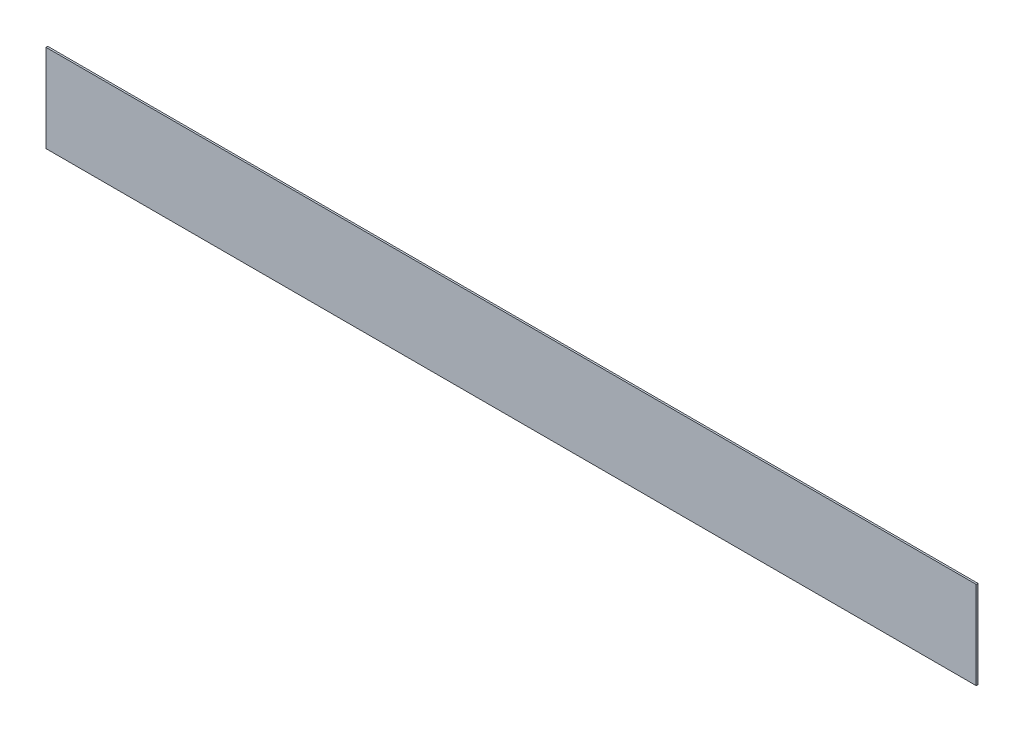
ISO-10303-21;
HEADER;
FILE_DESCRIPTION(('STEP AP214'),'2;1');
FILE_NAME('part.step','',(''),(''),'','','');
FILE_SCHEMA(('AUTOMOTIVE_DESIGN { 1 0 10303 214 1 1 1 1 }'));
ENDSEC;
DATA;
#1=APPLICATION_CONTEXT('core data for automotive mechanical design processes');
#2=APPLICATION_PROTOCOL_DEFINITION('international standard','automotive_design',2000,#1);
#3=PRODUCT_CONTEXT('',#1,'mechanical');
#4=PRODUCT('Part','Part','',(#3));
#5=PRODUCT_RELATED_PRODUCT_CATEGORY('part','',(#4));
#6=PRODUCT_DEFINITION_FORMATION('','',#4);
#7=PRODUCT_DEFINITION_CONTEXT('part definition',#1,'design');
#8=PRODUCT_DEFINITION('design','',#6,#7);
#9=PRODUCT_DEFINITION_SHAPE('','',#8);
#10=(LENGTH_UNIT() NAMED_UNIT(*) SI_UNIT(.MILLI.,.METRE.));
#11=(NAMED_UNIT(*) PLANE_ANGLE_UNIT() SI_UNIT($,.RADIAN.));
#12=(NAMED_UNIT(*) SI_UNIT($,.STERADIAN.) SOLID_ANGLE_UNIT());
#13=UNCERTAINTY_MEASURE_WITH_UNIT(LENGTH_MEASURE(1.E-05),#10,'distance_accuracy_value','');
#14=(GEOMETRIC_REPRESENTATION_CONTEXT(3) GLOBAL_UNCERTAINTY_ASSIGNED_CONTEXT((#13)) GLOBAL_UNIT_ASSIGNED_CONTEXT((#10,
#11,#12)) REPRESENTATION_CONTEXT('',''));
#15=CARTESIAN_POINT('',(0.,0.,0.));
#16=DIRECTION('',(0.,0.,1.));
#17=DIRECTION('',(1.,0.,0.));
#18=AXIS2_PLACEMENT_3D('',#15,#16,#17);
#19=CARTESIAN_POINT('',(77.9653007510579,83.2513709657373,-7.79018));
#20=DIRECTION('',(1.,0.,0.));
#21=DIRECTION('',(0.,-1.,0.));
#22=AXIS2_PLACEMENT_3D('',#19,#20,#21);
#23=PLANE('',#22);
#24=DIRECTION('',(0.,1.,0.));
#25=VECTOR('',#24,1.);
#26=CARTESIAN_POINT('',(77.9653007510579,83.2513709657373,-7.91718));
#27=LINE('',#26,#25);
#28=CARTESIAN_POINT('',(77.9653007510579,83.2513709657373,-7.91718));
#29=VERTEX_POINT('',#28);
#30=CARTESIAN_POINT('',(77.9653007510579,89.6013709657373,-7.91718));
#31=VERTEX_POINT('',#30);
#32=EDGE_CURVE('E11',#29,#31,#27,.T.);
#33=ORIENTED_EDGE('',*,*,#32,.T.);
#34=DIRECTION('',(0.,0.,-1.));
#35=VECTOR('',#34,1.);
#36=CARTESIAN_POINT('',(77.9653007510579,89.6013709657373,-7.79018));
#37=LINE('',#36,#35);
#38=CARTESIAN_POINT('',(77.9653007510579,89.6013709657373,-7.79018));
#39=VERTEX_POINT('',#38);
#40=EDGE_CURVE('E40',#39,#31,#37,.T.);
#41=ORIENTED_EDGE('',*,*,#40,.F.);
#42=DIRECTION('',(0.,1.,0.));
#43=VECTOR('',#42,1.);
#44=CARTESIAN_POINT('',(77.9653007510579,83.2513709657373,-7.79018));
#45=LINE('',#44,#43);
#46=CARTESIAN_POINT('',(77.9653007510579,83.2513709657373,-7.79018));
#47=VERTEX_POINT('',#46);
#48=EDGE_CURVE('E85',#47,#39,#45,.T.);
#49=ORIENTED_EDGE('',*,*,#48,.F.);
#50=DIRECTION('',(0.,0.,-1.));
#51=VECTOR('',#50,1.);
#52=CARTESIAN_POINT('',(77.9653007510579,83.2513709657373,-7.79018));
#53=LINE('',#52,#51);
#54=EDGE_CURVE('E27',#47,#29,#53,.T.);
#55=ORIENTED_EDGE('',*,*,#54,.T.);
#56=EDGE_LOOP('',(#33,#41,#49,#55));
#57=FACE_BOUND('',#56,.T.);
#58=ADVANCED_FACE('F16',(#57),#23,.T.);
#59=CARTESIAN_POINT('',(77.9653007510579,89.6013709657373,-7.79018));
#60=DIRECTION('',(0.,1.,0.));
#61=DIRECTION('',(0.,0.,1.));
#62=AXIS2_PLACEMENT_3D('',#59,#60,#61);
#63=PLANE('',#62);
#64=DIRECTION('',(-1.,0.,0.));
#65=VECTOR('',#64,1.);
#66=CARTESIAN_POINT('',(77.9653007510579,89.6013709657373,-7.91718));
#67=LINE('',#66,#65);
#68=CARTESIAN_POINT('',(10.655300751058,89.6013709657373,-7.91718));
#69=VERTEX_POINT('',#68);
#70=EDGE_CURVE('E94',#31,#69,#67,.T.);
#71=ORIENTED_EDGE('',*,*,#70,.T.);
#72=DIRECTION('',(0.,0.,-1.));
#73=VECTOR('',#72,1.);
#74=CARTESIAN_POINT('',(10.655300751058,89.6013709657373,-7.79018));
#75=LINE('',#74,#73);
#76=CARTESIAN_POINT('',(10.655300751058,89.6013709657373,-7.79018));
#77=VERTEX_POINT('',#76);
#78=EDGE_CURVE('E108',#77,#69,#75,.T.);
#79=ORIENTED_EDGE('',*,*,#78,.F.);
#80=DIRECTION('',(-1.,0.,0.));
#81=VECTOR('',#80,1.);
#82=CARTESIAN_POINT('',(77.9653007510579,89.6013709657373,-7.79018));
#83=LINE('',#82,#81);
#84=EDGE_CURVE('E55',#39,#77,#83,.T.);
#85=ORIENTED_EDGE('',*,*,#84,.F.);
#86=ORIENTED_EDGE('',*,*,#40,.T.);
#87=EDGE_LOOP('',(#71,#79,#85,#86));
#88=FACE_BOUND('',#87,.T.);
#89=ADVANCED_FACE('F134',(#88),#63,.T.);
#90=CARTESIAN_POINT('',(10.655300751058,89.6013709657373,-7.79018));
#91=DIRECTION('',(-1.,0.,0.));
#92=DIRECTION('',(0.,-1.,0.));
#93=AXIS2_PLACEMENT_3D('',#90,#91,#92);
#94=PLANE('',#93);
#95=DIRECTION('',(0.,-1.,0.));
#96=VECTOR('',#95,1.);
#97=CARTESIAN_POINT('',(10.655300751058,89.6013709657373,-7.91718));
#98=LINE('',#97,#96);
#99=CARTESIAN_POINT('',(10.655300751058,83.2513709657373,-7.91718));
#100=VERTEX_POINT('',#99);
#101=EDGE_CURVE('E20',#69,#100,#98,.T.);
#102=ORIENTED_EDGE('',*,*,#101,.T.);
#103=DIRECTION('',(0.,0.,-1.));
#104=VECTOR('',#103,1.);
#105=CARTESIAN_POINT('',(10.655300751058,83.2513709657373,-7.79018));
#106=LINE('',#105,#104);
#107=CARTESIAN_POINT('',(10.655300751058,83.2513709657373,-7.79018));
#108=VERTEX_POINT('',#107);
#109=EDGE_CURVE('E71',#108,#100,#106,.T.);
#110=ORIENTED_EDGE('',*,*,#109,.F.);
#111=DIRECTION('',(0.,-1.,0.));
#112=VECTOR('',#111,1.);
#113=CARTESIAN_POINT('',(10.655300751058,89.6013709657373,-7.79018));
#114=LINE('',#113,#112);
#115=EDGE_CURVE('E97',#77,#108,#114,.T.);
#116=ORIENTED_EDGE('',*,*,#115,.F.);
#117=ORIENTED_EDGE('',*,*,#78,.T.);
#118=EDGE_LOOP('',(#102,#110,#116,#117));
#119=FACE_BOUND('',#118,.T.);
#120=ADVANCED_FACE('F142',(#119),#94,.T.);
#121=CARTESIAN_POINT('',(10.655300751058,83.2513709657373,-7.79018));
#122=DIRECTION('',(0.,-1.,0.));
#123=DIRECTION('',(1.,0.,0.));
#124=AXIS2_PLACEMENT_3D('',#121,#122,#123);
#125=PLANE('',#124);
#126=DIRECTION('',(1.,0.,0.));
#127=VECTOR('',#126,1.);
#128=CARTESIAN_POINT('',(10.655300751058,83.2513709657373,-7.91718));
#129=LINE('',#128,#127);
#130=EDGE_CURVE('E92',#100,#29,#129,.T.);
#131=ORIENTED_EDGE('',*,*,#130,.T.);
#132=ORIENTED_EDGE('',*,*,#54,.F.);
#133=DIRECTION('',(1.,0.,0.));
#134=VECTOR('',#133,1.);
#135=CARTESIAN_POINT('',(10.655300751058,83.2513709657373,-7.79018));
#136=LINE('',#135,#134);
#137=EDGE_CURVE('E88',#108,#47,#136,.T.);
#138=ORIENTED_EDGE('',*,*,#137,.F.);
#139=ORIENTED_EDGE('',*,*,#109,.T.);
#140=EDGE_LOOP('',(#131,#132,#138,#139));
#141=FACE_BOUND('',#140,.T.);
#142=ADVANCED_FACE('F90',(#141),#125,.T.);
#143=CARTESIAN_POINT('',(44.310300751058,86.4263709657373,-7.91718));
#144=DIRECTION('',(0.,0.,-1.));
#145=DIRECTION('',(1.,0.,0.));
#146=AXIS2_PLACEMENT_3D('',#143,#144,#145);
#147=PLANE('',#146);
#148=ORIENTED_EDGE('',*,*,#32,.F.);
#149=ORIENTED_EDGE('',*,*,#130,.F.);
#150=ORIENTED_EDGE('',*,*,#101,.F.);
#151=ORIENTED_EDGE('',*,*,#70,.F.);
#152=EDGE_LOOP('',(#148,#149,#150,#151));
#153=FACE_BOUND('',#152,.T.);
#154=ADVANCED_FACE('F155',(#153),#147,.T.);
#155=CARTESIAN_POINT('',(44.310300751058,86.4263709657373,-7.79018));
#156=DIRECTION('',(0.,0.,-1.));
#157=DIRECTION('',(1.,0.,0.));
#158=AXIS2_PLACEMENT_3D('',#155,#156,#157);
#159=PLANE('',#158);
#160=ORIENTED_EDGE('',*,*,#137,.T.);
#161=ORIENTED_EDGE('',*,*,#48,.T.);
#162=ORIENTED_EDGE('',*,*,#84,.T.);
#163=ORIENTED_EDGE('',*,*,#115,.T.);
#164=EDGE_LOOP('',(#160,#161,#162,#163));
#165=FACE_BOUND('',#164,.T.);
#166=ADVANCED_FACE('F18',(#165),#159,.F.);
#167=CLOSED_SHELL('',(#58,#89,#120,#142,#154,#166));
#168=MANIFOLD_SOLID_BREP('B1',#167);
#169=ADVANCED_BREP_SHAPE_REPRESENTATION('',(#18,#168),#14);
#170=SHAPE_DEFINITION_REPRESENTATION(#9,#169);
ENDSEC;
END-ISO-10303-21;
